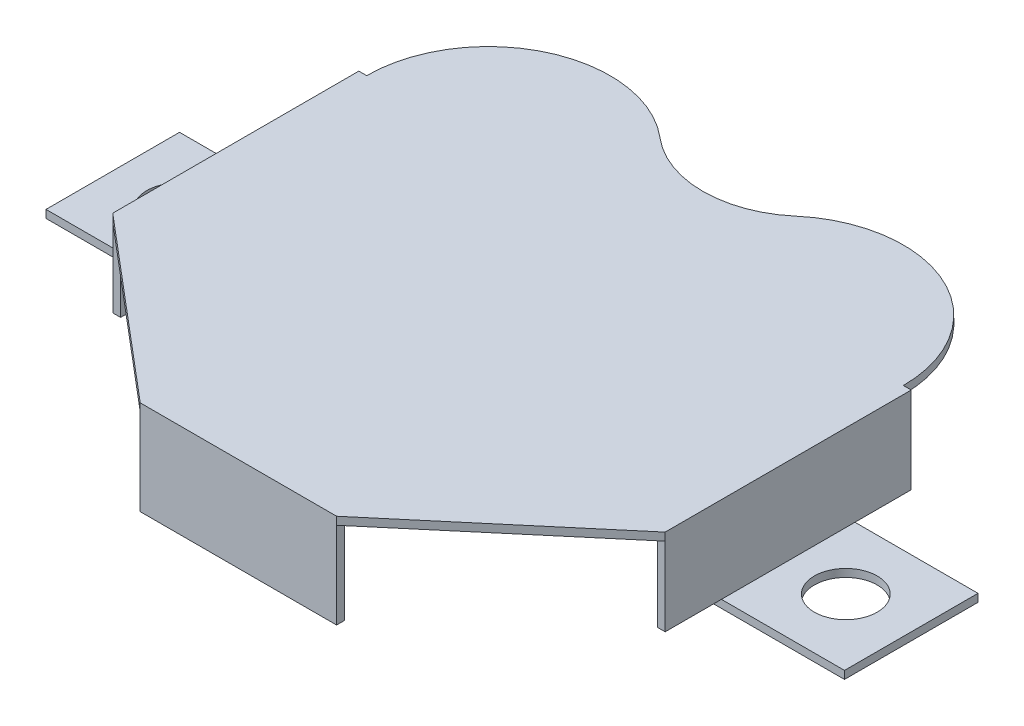
ISO-10303-21;
HEADER;
FILE_DESCRIPTION(('STEP AP214'),'2;1');
FILE_NAME('part.step','',(''),(''),'','','');
FILE_SCHEMA(('AUTOMOTIVE_DESIGN { 1 0 10303 214 1 1 1 1 }'));
ENDSEC;
DATA;
#1=APPLICATION_CONTEXT('core data for automotive mechanical design processes');
#2=APPLICATION_PROTOCOL_DEFINITION('international standard','automotive_design',2000,#1);
#3=PRODUCT_CONTEXT('',#1,'mechanical');
#4=PRODUCT('Part','Part','',(#3));
#5=PRODUCT_RELATED_PRODUCT_CATEGORY('part','',(#4));
#6=PRODUCT_DEFINITION_FORMATION('','',#4);
#7=PRODUCT_DEFINITION_CONTEXT('part definition',#1,'design');
#8=PRODUCT_DEFINITION('design','',#6,#7);
#9=PRODUCT_DEFINITION_SHAPE('','',#8);
#10=(LENGTH_UNIT() NAMED_UNIT(*) SI_UNIT(.MILLI.,.METRE.));
#11=(NAMED_UNIT(*) PLANE_ANGLE_UNIT() SI_UNIT($,.RADIAN.));
#12=(NAMED_UNIT(*) SI_UNIT($,.STERADIAN.) SOLID_ANGLE_UNIT());
#13=UNCERTAINTY_MEASURE_WITH_UNIT(LENGTH_MEASURE(1.E-05),#10,'distance_accuracy_value','');
#14=(GEOMETRIC_REPRESENTATION_CONTEXT(3) GLOBAL_UNCERTAINTY_ASSIGNED_CONTEXT((#13)) GLOBAL_UNIT_ASSIGNED_CONTEXT((#10,
#11,#12)) REPRESENTATION_CONTEXT('',''));
#15=CARTESIAN_POINT('',(0.,0.,0.));
#16=DIRECTION('',(0.,0.,1.));
#17=DIRECTION('',(1.,0.,0.));
#18=AXIS2_PLACEMENT_3D('',#15,#16,#17);
#19=CARTESIAN_POINT('',(-5.6,3.3,-4.7));
#20=DIRECTION('',(0.,-1.,0.));
#21=DIRECTION('',(0.,0.,-1.));
#22=AXIS2_PLACEMENT_3D('',#19,#20,#21);
#23=PLANE('',#22);
#24=CARTESIAN_POINT('',(5.60000000000001,3.3,-4.7));
#25=DIRECTION('',(0.,1.,0.));
#26=DIRECTION('',(0.,0.,1.));
#27=AXIS2_PLACEMENT_3D('',#24,#25,#26);
#28=CIRCLE('',#27,4.64999999999999);
#29=CARTESIAN_POINT('',(10.25,3.3,-4.7));
#30=VERTEX_POINT('',#29);
#31=CARTESIAN_POINT('',(2.58755539714736,3.3,-8.24227010753611));
#32=VERTEX_POINT('',#31);
#33=EDGE_CURVE('E386',#30,#32,#28,.T.);
#34=ORIENTED_EDGE('',*,*,#33,.F.);
#35=DIRECTION('',(0.,0.,1.));
#36=VECTOR('',#35,1.);
#37=CARTESIAN_POINT('',(10.25,3.3,-4.7));
#38=LINE('',#37,#36);
#39=CARTESIAN_POINT('',(10.25,3.3,4.7));
#40=VERTEX_POINT('',#39);
#41=EDGE_CURVE('E52',#30,#40,#38,.T.);
#42=ORIENTED_EDGE('',*,*,#41,.T.);
#43=DIRECTION('',(1.,0.,0.));
#44=VECTOR('',#43,1.);
#45=CARTESIAN_POINT('',(10.25,3.3,4.7));
#46=LINE('',#45,#44);
#47=CARTESIAN_POINT('',(10.55,3.3,4.7));
#48=VERTEX_POINT('',#47);
#49=EDGE_CURVE('E236',#40,#48,#46,.T.);
#50=ORIENTED_EDGE('',*,*,#49,.T.);
#51=DIRECTION('',(0.763599215260191,0.,-0.645690512903838));
#52=VECTOR('',#51,1.);
#53=CARTESIAN_POINT('',(3.75,3.3,10.45));
#54=LINE('',#53,#52);
#55=CARTESIAN_POINT('',(3.75,3.3,10.45));
#56=VERTEX_POINT('',#55);
#57=EDGE_CURVE('E355',#56,#48,#54,.T.);
#58=ORIENTED_EDGE('',*,*,#57,.F.);
#59=DIRECTION('',(0.,0.,-1.));
#60=VECTOR('',#59,1.);
#61=CARTESIAN_POINT('',(3.75,3.3,10.15));
#62=LINE('',#61,#60);
#63=CARTESIAN_POINT('',(3.75,3.3,10.15));
#64=VERTEX_POINT('',#63);
#65=EDGE_CURVE('E420',#56,#64,#62,.T.);
#66=ORIENTED_EDGE('',*,*,#65,.T.);
#67=DIRECTION('',(-1.,0.,0.));
#68=VECTOR('',#67,1.);
#69=CARTESIAN_POINT('',(3.75,3.3,10.15));
#70=LINE('',#69,#68);
#71=CARTESIAN_POINT('',(-3.75,3.3,10.15));
#72=VERTEX_POINT('',#71);
#73=EDGE_CURVE('E417',#64,#72,#70,.T.);
#74=ORIENTED_EDGE('',*,*,#73,.T.);
#75=DIRECTION('',(0.,0.,1.));
#76=VECTOR('',#75,1.);
#77=CARTESIAN_POINT('',(-3.75,3.3,10.15));
#78=LINE('',#77,#76);
#79=CARTESIAN_POINT('',(-3.75,3.3,10.45));
#80=VERTEX_POINT('',#79);
#81=EDGE_CURVE('E394',#72,#80,#78,.T.);
#82=ORIENTED_EDGE('',*,*,#81,.T.);
#83=DIRECTION('',(-0.76359921526019,0.,-0.645690512903838));
#84=VECTOR('',#83,1.);
#85=CARTESIAN_POINT('',(-3.75,3.3,10.45));
#86=LINE('',#85,#84);
#87=CARTESIAN_POINT('',(-10.55,3.3,4.7));
#88=VERTEX_POINT('',#87);
#89=EDGE_CURVE('E377',#80,#88,#86,.T.);
#90=ORIENTED_EDGE('',*,*,#89,.T.);
#91=DIRECTION('',(1.,0.,0.));
#92=VECTOR('',#91,1.);
#93=CARTESIAN_POINT('',(-10.55,3.3,4.7));
#94=LINE('',#93,#92);
#95=CARTESIAN_POINT('',(-10.25,3.3,4.7));
#96=VERTEX_POINT('',#95);
#97=EDGE_CURVE('E285',#88,#96,#94,.T.);
#98=ORIENTED_EDGE('',*,*,#97,.T.);
#99=DIRECTION('',(0.,0.,-1.));
#100=VECTOR('',#99,1.);
#101=CARTESIAN_POINT('',(-10.25,3.3,-4.7));
#102=LINE('',#101,#100);
#103=CARTESIAN_POINT('',(-10.25,3.3,-4.7));
#104=VERTEX_POINT('',#103);
#105=EDGE_CURVE('E288',#96,#104,#102,.T.);
#106=ORIENTED_EDGE('',*,*,#105,.T.);
#107=CARTESIAN_POINT('',(-5.6,3.3,-4.7));
#108=DIRECTION('',(0.,-1.,0.));
#109=DIRECTION('',(0.,0.,-1.));
#110=AXIS2_PLACEMENT_3D('',#107,#108,#109);
#111=CIRCLE('',#110,4.65);
#112=CARTESIAN_POINT('',(-2.58755539714735,3.3,-8.24227010753611));
#113=VERTEX_POINT('',#112);
#114=EDGE_CURVE('E380',#104,#113,#111,.T.);
#115=ORIENTED_EDGE('',*,*,#114,.T.);
#116=CARTESIAN_POINT('',(0.,3.3,-11.284921954554));
#117=DIRECTION('',(0.,1.,0.));
#118=DIRECTION('',(0.,0.,1.));
#119=AXIS2_PLACEMENT_3D('',#116,#117,#118);
#120=CIRCLE('',#119,3.99414236044085);
#121=EDGE_CURVE('E383',#113,#32,#120,.T.);
#122=ORIENTED_EDGE('',*,*,#121,.T.);
#123=EDGE_LOOP('',(#34,#42,#50,#58,#66,#74,#82,#90,#98,#106,#115,#122));
#124=FACE_BOUND('',#123,.T.);
#125=ADVANCED_FACE('F37',(#124),#23,.T.);
#126=CARTESIAN_POINT('',(-3.75,0.3,10.15));
#127=DIRECTION('',(1.,0.,0.));
#128=DIRECTION('',(0.,0.,-1.));
#129=AXIS2_PLACEMENT_3D('',#126,#127,#128);
#130=PLANE('',#129);
#131=DIRECTION('',(0.,0.,1.));
#132=VECTOR('',#131,1.);
#133=CARTESIAN_POINT('',(-3.75,0.,10.15));
#134=LINE('',#133,#132);
#135=CARTESIAN_POINT('',(-3.75,0.,10.15));
#136=VERTEX_POINT('',#135);
#137=CARTESIAN_POINT('',(-3.75,0.,10.45));
#138=VERTEX_POINT('',#137);
#139=EDGE_CURVE('E11',#136,#138,#134,.T.);
#140=ORIENTED_EDGE('',*,*,#139,.T.);
#141=DIRECTION('',(0.,-1.,0.));
#142=VECTOR('',#141,1.);
#143=CARTESIAN_POINT('',(-3.75,0.3,10.45));
#144=LINE('',#143,#142);
#145=EDGE_CURVE('E423',#80,#138,#144,.T.);
#146=ORIENTED_EDGE('',*,*,#145,.F.);
#147=ORIENTED_EDGE('',*,*,#81,.F.);
#148=DIRECTION('',(0.,-1.,0.));
#149=VECTOR('',#148,1.);
#150=CARTESIAN_POINT('',(-3.75,0.3,10.15));
#151=LINE('',#150,#149);
#152=EDGE_CURVE('E431',#72,#136,#151,.T.);
#153=ORIENTED_EDGE('',*,*,#152,.T.);
#154=EDGE_LOOP('',(#140,#146,#147,#153));
#155=FACE_BOUND('',#154,.T.);
#156=ADVANCED_FACE('F449',(#155),#130,.F.);
#157=CARTESIAN_POINT('',(-3.75,0.3,10.45));
#158=DIRECTION('',(0.,0.,-1.));
#159=DIRECTION('',(-1.,0.,0.));
#160=AXIS2_PLACEMENT_3D('',#157,#158,#159);
#161=PLANE('',#160);
#162=DIRECTION('',(1.,0.,0.));
#163=VECTOR('',#162,1.);
#164=CARTESIAN_POINT('',(-3.75,0.,10.45));
#165=LINE('',#164,#163);
#166=CARTESIAN_POINT('',(3.75,0.,10.45));
#167=VERTEX_POINT('',#166);
#168=EDGE_CURVE('E45',#138,#167,#165,.T.);
#169=ORIENTED_EDGE('',*,*,#168,.T.);
#170=DIRECTION('',(0.,-1.,0.));
#171=VECTOR('',#170,1.);
#172=CARTESIAN_POINT('',(3.75,0.3,10.45));
#173=LINE('',#172,#171);
#174=EDGE_CURVE('E425',#56,#167,#173,.T.);
#175=ORIENTED_EDGE('',*,*,#174,.F.);
#176=DIRECTION('',(0.,-1.,0.));
#177=VECTOR('',#176,1.);
#178=CARTESIAN_POINT('',(3.75,3.6,10.45));
#179=LINE('',#178,#177);
#180=CARTESIAN_POINT('',(3.75,3.6,10.45));
#181=VERTEX_POINT('',#180);
#182=EDGE_CURVE('E395',#181,#56,#179,.T.);
#183=ORIENTED_EDGE('',*,*,#182,.F.);
#184=DIRECTION('',(1.,0.,0.));
#185=VECTOR('',#184,1.);
#186=CARTESIAN_POINT('',(-3.75,3.6,10.45));
#187=LINE('',#186,#185);
#188=CARTESIAN_POINT('',(-3.75,3.6,10.45));
#189=VERTEX_POINT('',#188);
#190=EDGE_CURVE('E374',#189,#181,#187,.T.);
#191=ORIENTED_EDGE('',*,*,#190,.F.);
#192=DIRECTION('',(0.,-1.,0.));
#193=VECTOR('',#192,1.);
#194=CARTESIAN_POINT('',(-3.75,3.6,10.45));
#195=LINE('',#194,#193);
#196=EDGE_CURVE('E391',#189,#80,#195,.T.);
#197=ORIENTED_EDGE('',*,*,#196,.T.);
#198=ORIENTED_EDGE('',*,*,#145,.T.);
#199=EDGE_LOOP('',(#169,#175,#183,#191,#197,#198));
#200=FACE_BOUND('',#199,.T.);
#201=ADVANCED_FACE('F438',(#200),#161,.F.);
#202=CARTESIAN_POINT('',(3.75,0.3,10.15));
#203=DIRECTION('',(-1.,0.,0.));
#204=DIRECTION('',(0.,0.,1.));
#205=AXIS2_PLACEMENT_3D('',#202,#203,#204);
#206=PLANE('',#205);
#207=DIRECTION('',(0.,0.,-1.));
#208=VECTOR('',#207,1.);
#209=CARTESIAN_POINT('',(3.75,0.,10.15));
#210=LINE('',#209,#208);
#211=CARTESIAN_POINT('',(3.75,0.,10.15));
#212=VERTEX_POINT('',#211);
#213=EDGE_CURVE('E436',#167,#212,#210,.T.);
#214=ORIENTED_EDGE('',*,*,#213,.T.);
#215=DIRECTION('',(0.,-1.,0.));
#216=VECTOR('',#215,1.);
#217=CARTESIAN_POINT('',(3.75,0.3,10.15));
#218=LINE('',#217,#216);
#219=EDGE_CURVE('E428',#64,#212,#218,.T.);
#220=ORIENTED_EDGE('',*,*,#219,.F.);
#221=ORIENTED_EDGE('',*,*,#65,.F.);
#222=ORIENTED_EDGE('',*,*,#174,.T.);
#223=EDGE_LOOP('',(#214,#220,#221,#222));
#224=FACE_BOUND('',#223,.T.);
#225=ADVANCED_FACE('F442',(#224),#206,.F.);
#226=CARTESIAN_POINT('',(-3.75,0.3,10.15));
#227=DIRECTION('',(0.,0.,1.));
#228=DIRECTION('',(1.,0.,0.));
#229=AXIS2_PLACEMENT_3D('',#226,#227,#228);
#230=PLANE('',#229);
#231=DIRECTION('',(-1.,0.,0.));
#232=VECTOR('',#231,1.);
#233=CARTESIAN_POINT('',(-3.75,0.,10.15));
#234=LINE('',#233,#232);
#235=EDGE_CURVE('E434',#212,#136,#234,.T.);
#236=ORIENTED_EDGE('',*,*,#235,.T.);
#237=ORIENTED_EDGE('',*,*,#152,.F.);
#238=ORIENTED_EDGE('',*,*,#73,.F.);
#239=ORIENTED_EDGE('',*,*,#219,.T.);
#240=EDGE_LOOP('',(#236,#237,#238,#239));
#241=FACE_BOUND('',#240,.T.);
#242=ADVANCED_FACE('F445',(#241),#230,.F.);
#243=CARTESIAN_POINT('',(0.,0.,0.));
#244=DIRECTION('',(0.,1.,0.));
#245=DIRECTION('',(0.,0.,1.));
#246=AXIS2_PLACEMENT_3D('',#243,#244,#245);
#247=PLANE('',#246);
#248=ORIENTED_EDGE('',*,*,#139,.F.);
#249=ORIENTED_EDGE('',*,*,#235,.F.);
#250=ORIENTED_EDGE('',*,*,#213,.F.);
#251=ORIENTED_EDGE('',*,*,#168,.F.);
#252=EDGE_LOOP('',(#248,#249,#250,#251));
#253=FACE_BOUND('',#252,.T.);
#254=ADVANCED_FACE('F39',(#253),#247,.F.);
#255=CARTESIAN_POINT('',(-3.75,3.6,10.45));
#256=DIRECTION('',(-0.645690512903838,0.,0.76359921526019));
#257=DIRECTION('',(0.763599215260191,0.,0.645690512903838));
#258=AXIS2_PLACEMENT_3D('',#255,#256,#257);
#259=PLANE('',#258);
#260=ORIENTED_EDGE('',*,*,#89,.F.);
#261=ORIENTED_EDGE('',*,*,#196,.F.);
#262=DIRECTION('',(-0.76359921526019,0.,-0.645690512903838));
#263=VECTOR('',#262,1.);
#264=CARTESIAN_POINT('',(-3.75,3.6,10.45));
#265=LINE('',#264,#263);
#266=CARTESIAN_POINT('',(-10.55,3.6,4.7));
#267=VERTEX_POINT('',#266);
#268=EDGE_CURVE('E351',#189,#267,#265,.T.);
#269=ORIENTED_EDGE('',*,*,#268,.T.);
#270=DIRECTION('',(0.,-1.,0.));
#271=VECTOR('',#270,1.);
#272=CARTESIAN_POINT('',(-10.55,3.6,4.7));
#273=LINE('',#272,#271);
#274=EDGE_CURVE('E376',#267,#88,#273,.T.);
#275=ORIENTED_EDGE('',*,*,#274,.T.);
#276=EDGE_LOOP('',(#260,#261,#269,#275));
#277=FACE_BOUND('',#276,.T.);
#278=ADVANCED_FACE('F540',(#277),#259,.T.);
#279=CARTESIAN_POINT('',(3.75,3.6,10.45));
#280=DIRECTION('',(-0.645690512903838,0.,-0.763599215260191));
#281=DIRECTION('',(-0.763599215260191,0.,0.645690512903838));
#282=AXIS2_PLACEMENT_3D('',#279,#280,#281);
#283=PLANE('',#282);
#284=ORIENTED_EDGE('',*,*,#57,.T.);
#285=DIRECTION('',(0.,-1.,0.));
#286=VECTOR('',#285,1.);
#287=CARTESIAN_POINT('',(10.55,3.6,4.7));
#288=LINE('',#287,#286);
#289=CARTESIAN_POINT('',(10.55,3.6,4.7));
#290=VERTEX_POINT('',#289);
#291=EDGE_CURVE('E398',#290,#48,#288,.T.);
#292=ORIENTED_EDGE('',*,*,#291,.F.);
#293=DIRECTION('',(0.763599215260191,0.,-0.645690512903838));
#294=VECTOR('',#293,1.);
#295=CARTESIAN_POINT('',(3.75,3.6,10.45));
#296=LINE('',#295,#294);
#297=EDGE_CURVE('E372',#181,#290,#296,.T.);
#298=ORIENTED_EDGE('',*,*,#297,.F.);
#299=ORIENTED_EDGE('',*,*,#182,.T.);
#300=EDGE_LOOP('',(#284,#292,#298,#299));
#301=FACE_BOUND('',#300,.T.);
#302=ADVANCED_FACE('F454',(#301),#283,.F.);
#303=CARTESIAN_POINT('',(10.55,3.6,-4.7));
#304=DIRECTION('',(1.,0.,0.));
#305=DIRECTION('',(0.,0.,-1.));
#306=AXIS2_PLACEMENT_3D('',#303,#304,#305);
#307=PLANE('',#306);
#308=ORIENTED_EDGE('',*,*,#291,.T.);
#309=DIRECTION('',(0.,-1.,0.));
#310=VECTOR('',#309,1.);
#311=CARTESIAN_POINT('',(10.55,3.3,4.7));
#312=LINE('',#311,#310);
#313=CARTESIAN_POINT('',(10.55,0.3,4.7));
#314=VERTEX_POINT('',#313);
#315=EDGE_CURVE('E237',#48,#314,#312,.T.);
#316=ORIENTED_EDGE('',*,*,#315,.T.);
#317=DIRECTION('',(0.,0.,-1.));
#318=VECTOR('',#317,1.);
#319=CARTESIAN_POINT('',(10.55,0.3,-4.7));
#320=LINE('',#319,#318);
#321=CARTESIAN_POINT('',(10.55,0.3,2.55));
#322=VERTEX_POINT('',#321);
#323=EDGE_CURVE('E467',#314,#322,#320,.T.);
#324=ORIENTED_EDGE('',*,*,#323,.T.);
#325=CARTESIAN_POINT('',(10.55,0.3,-2.55));
#326=VERTEX_POINT('',#325);
#327=EDGE_CURVE('E284',#322,#326,#320,.T.);
#328=ORIENTED_EDGE('',*,*,#327,.T.);
#329=CARTESIAN_POINT('',(10.55,0.3,-4.7));
#330=VERTEX_POINT('',#329);
#331=EDGE_CURVE('E227',#326,#330,#320,.T.);
#332=ORIENTED_EDGE('',*,*,#331,.T.);
#333=DIRECTION('',(0.,-1.,0.));
#334=VECTOR('',#333,1.);
#335=CARTESIAN_POINT('',(10.55,3.6,-4.7));
#336=LINE('',#335,#334);
#337=CARTESIAN_POINT('',(10.55,3.6,-4.7));
#338=VERTEX_POINT('',#337);
#339=EDGE_CURVE('E222',#338,#330,#336,.T.);
#340=ORIENTED_EDGE('',*,*,#339,.F.);
#341=DIRECTION('',(0.,0.,1.));
#342=VECTOR('',#341,1.);
#343=CARTESIAN_POINT('',(10.55,3.6,-4.7));
#344=LINE('',#343,#342);
#345=EDGE_CURVE('E369',#338,#290,#344,.T.);
#346=ORIENTED_EDGE('',*,*,#345,.T.);
#347=EDGE_LOOP('',(#308,#316,#324,#328,#332,#340,#346));
#348=FACE_BOUND('',#347,.T.);
#349=ADVANCED_FACE('F539',(#348),#307,.T.);
#350=CARTESIAN_POINT('',(10.25,3.6,-4.7));
#351=DIRECTION('',(0.,0.,-1.));
#352=DIRECTION('',(-1.,0.,0.));
#353=AXIS2_PLACEMENT_3D('',#350,#351,#352);
#354=PLANE('',#353);
#355=ORIENTED_EDGE('',*,*,#339,.T.);
#356=DIRECTION('',(-1.,0.,0.));
#357=VECTOR('',#356,1.);
#358=CARTESIAN_POINT('',(10.25,0.3,-4.7));
#359=LINE('',#358,#357);
#360=CARTESIAN_POINT('',(10.25,0.3,-4.7));
#361=VERTEX_POINT('',#360);
#362=EDGE_CURVE('E217',#330,#361,#359,.T.);
#363=ORIENTED_EDGE('',*,*,#362,.T.);
#364=DIRECTION('',(0.,-1.,0.));
#365=VECTOR('',#364,1.);
#366=CARTESIAN_POINT('',(10.25,3.3,-4.7));
#367=LINE('',#366,#365);
#368=EDGE_CURVE('E220',#30,#361,#367,.T.);
#369=ORIENTED_EDGE('',*,*,#368,.F.);
#370=DIRECTION('',(0.,-1.,0.));
#371=VECTOR('',#370,1.);
#372=CARTESIAN_POINT('',(10.25,3.6,-4.7));
#373=LINE('',#372,#371);
#374=CARTESIAN_POINT('',(10.25,3.6,-4.7));
#375=VERTEX_POINT('',#374);
#376=EDGE_CURVE('E402',#375,#30,#373,.T.);
#377=ORIENTED_EDGE('',*,*,#376,.F.);
#378=DIRECTION('',(1.,0.,0.));
#379=VECTOR('',#378,1.);
#380=CARTESIAN_POINT('',(10.25,3.6,-4.7));
#381=LINE('',#380,#379);
#382=EDGE_CURVE('E367',#375,#338,#381,.T.);
#383=ORIENTED_EDGE('',*,*,#382,.T.);
#384=EDGE_LOOP('',(#355,#363,#369,#377,#383));
#385=FACE_BOUND('',#384,.T.);
#386=ADVANCED_FACE('F219',(#385),#354,.T.);
#387=CARTESIAN_POINT('',(5.60000000000001,3.6,-4.7));
#388=DIRECTION('',(0.,-1.,0.));
#389=DIRECTION('',(0.,0.,-1.));
#390=AXIS2_PLACEMENT_3D('',#387,#388,#389);
#391=CYLINDRICAL_SURFACE('',#390,4.64999999999999);
#392=ORIENTED_EDGE('',*,*,#33,.T.);
#393=DIRECTION('',(0.,-1.,0.));
#394=VECTOR('',#393,1.);
#395=CARTESIAN_POINT('',(2.58755539714736,3.6,-8.24227010753611));
#396=LINE('',#395,#394);
#397=CARTESIAN_POINT('',(2.58755539714736,3.6,-8.24227010753611));
#398=VERTEX_POINT('',#397);
#399=EDGE_CURVE('E404',#398,#32,#396,.T.);
#400=ORIENTED_EDGE('',*,*,#399,.F.);
#401=CARTESIAN_POINT('',(5.60000000000001,3.6,-4.7));
#402=DIRECTION('',(0.,1.,0.));
#403=DIRECTION('',(0.,0.,1.));
#404=AXIS2_PLACEMENT_3D('',#401,#402,#403);
#405=CIRCLE('',#404,4.64999999999999);
#406=EDGE_CURVE('E365',#375,#398,#405,.T.);
#407=ORIENTED_EDGE('',*,*,#406,.F.);
#408=ORIENTED_EDGE('',*,*,#376,.T.);
#409=EDGE_LOOP('',(#392,#400,#407,#408));
#410=FACE_BOUND('',#409,.T.);
#411=ADVANCED_FACE('F545',(#410),#391,.T.);
#412=CARTESIAN_POINT('',(0.,3.6,-11.284921954554));
#413=DIRECTION('',(0.,-1.,0.));
#414=DIRECTION('',(0.,0.,-1.));
#415=AXIS2_PLACEMENT_3D('',#412,#413,#414);
#416=CYLINDRICAL_SURFACE('',#415,3.99414236044085);
#417=ORIENTED_EDGE('',*,*,#121,.F.);
#418=DIRECTION('',(0.,-1.,0.));
#419=VECTOR('',#418,1.);
#420=CARTESIAN_POINT('',(-2.58755539714735,3.6,-8.24227010753611));
#421=LINE('',#420,#419);
#422=CARTESIAN_POINT('',(-2.58755539714735,3.6,-8.24227010753611));
#423=VERTEX_POINT('',#422);
#424=EDGE_CURVE('E406',#423,#113,#421,.T.);
#425=ORIENTED_EDGE('',*,*,#424,.F.);
#426=CARTESIAN_POINT('',(0.,3.6,-11.284921954554));
#427=DIRECTION('',(0.,1.,0.));
#428=DIRECTION('',(0.,0.,1.));
#429=AXIS2_PLACEMENT_3D('',#426,#427,#428);
#430=CIRCLE('',#429,3.99414236044085);
#431=EDGE_CURVE('E362',#423,#398,#430,.T.);
#432=ORIENTED_EDGE('',*,*,#431,.T.);
#433=ORIENTED_EDGE('',*,*,#399,.T.);
#434=EDGE_LOOP('',(#417,#425,#432,#433));
#435=FACE_BOUND('',#434,.T.);
#436=ADVANCED_FACE('F548',(#435),#416,.F.);
#437=CARTESIAN_POINT('',(-5.6,3.6,-4.7));
#438=DIRECTION('',(0.,-1.,0.));
#439=DIRECTION('',(0.,0.,-1.));
#440=AXIS2_PLACEMENT_3D('',#437,#438,#439);
#441=CYLINDRICAL_SURFACE('',#440,4.65);
#442=ORIENTED_EDGE('',*,*,#114,.F.);
#443=DIRECTION('',(0.,-1.,0.));
#444=VECTOR('',#443,1.);
#445=CARTESIAN_POINT('',(-10.25,3.6,-4.7));
#446=LINE('',#445,#444);
#447=CARTESIAN_POINT('',(-10.25,3.6,-4.7));
#448=VERTEX_POINT('',#447);
#449=EDGE_CURVE('E408',#448,#104,#446,.T.);
#450=ORIENTED_EDGE('',*,*,#449,.F.);
#451=CARTESIAN_POINT('',(-5.6,3.6,-4.7));
#452=DIRECTION('',(0.,-1.,0.));
#453=DIRECTION('',(0.,0.,-1.));
#454=AXIS2_PLACEMENT_3D('',#451,#452,#453);
#455=CIRCLE('',#454,4.65);
#456=EDGE_CURVE('E359',#448,#423,#455,.T.);
#457=ORIENTED_EDGE('',*,*,#456,.T.);
#458=ORIENTED_EDGE('',*,*,#424,.T.);
#459=EDGE_LOOP('',(#442,#450,#457,#458));
#460=FACE_BOUND('',#459,.T.);
#461=ADVANCED_FACE('F500',(#460),#441,.T.);
#462=CARTESIAN_POINT('',(-10.25,3.6,-4.7));
#463=DIRECTION('',(0.,0.,1.));
#464=DIRECTION('',(1.,0.,0.));
#465=AXIS2_PLACEMENT_3D('',#462,#463,#464);
#466=PLANE('',#465);
#467=ORIENTED_EDGE('',*,*,#449,.T.);
#468=DIRECTION('',(0.,-1.,0.));
#469=VECTOR('',#468,1.);
#470=CARTESIAN_POINT('',(-10.25,3.3,-4.7));
#471=LINE('',#470,#469);
#472=CARTESIAN_POINT('',(-10.25,0.3,-4.7));
#473=VERTEX_POINT('',#472);
#474=EDGE_CURVE('E292',#104,#473,#471,.T.);
#475=ORIENTED_EDGE('',*,*,#474,.T.);
#476=DIRECTION('',(-1.,0.,0.));
#477=VECTOR('',#476,1.);
#478=CARTESIAN_POINT('',(-10.55,0.3,-4.7));
#479=LINE('',#478,#477);
#480=CARTESIAN_POINT('',(-10.55,0.3,-4.7));
#481=VERTEX_POINT('',#480);
#482=EDGE_CURVE('E289',#473,#481,#479,.T.);
#483=ORIENTED_EDGE('',*,*,#482,.T.);
#484=DIRECTION('',(0.,-1.,0.));
#485=VECTOR('',#484,1.);
#486=CARTESIAN_POINT('',(-10.55,3.6,-4.7));
#487=LINE('',#486,#485);
#488=CARTESIAN_POINT('',(-10.55,3.6,-4.7));
#489=VERTEX_POINT('',#488);
#490=EDGE_CURVE('E411',#489,#481,#487,.T.);
#491=ORIENTED_EDGE('',*,*,#490,.F.);
#492=DIRECTION('',(-1.,0.,0.));
#493=VECTOR('',#492,1.);
#494=CARTESIAN_POINT('',(-10.25,3.6,-4.7));
#495=LINE('',#494,#493);
#496=EDGE_CURVE('E357',#448,#489,#495,.T.);
#497=ORIENTED_EDGE('',*,*,#496,.F.);
#498=EDGE_LOOP('',(#467,#475,#483,#491,#497));
#499=FACE_BOUND('',#498,.T.);
#500=ADVANCED_FACE('F494',(#499),#466,.F.);
#501=CARTESIAN_POINT('',(-10.55,3.6,-4.7));
#502=DIRECTION('',(1.,0.,0.));
#503=DIRECTION('',(0.,0.,-1.));
#504=AXIS2_PLACEMENT_3D('',#501,#502,#503);
#505=PLANE('',#504);
#506=ORIENTED_EDGE('',*,*,#490,.T.);
#507=DIRECTION('',(0.,0.,1.));
#508=VECTOR('',#507,1.);
#509=CARTESIAN_POINT('',(-10.55,0.3,-4.7));
#510=LINE('',#509,#508);
#511=CARTESIAN_POINT('',(-10.55,0.3,-2.55));
#512=VERTEX_POINT('',#511);
#513=EDGE_CURVE('E293',#481,#512,#510,.T.);
#514=ORIENTED_EDGE('',*,*,#513,.T.);
#515=CARTESIAN_POINT('',(-10.55,0.3,2.55));
#516=VERTEX_POINT('',#515);
#517=EDGE_CURVE('E298',#512,#516,#510,.T.);
#518=ORIENTED_EDGE('',*,*,#517,.T.);
#519=CARTESIAN_POINT('',(-10.55,0.3,4.7));
#520=VERTEX_POINT('',#519);
#521=EDGE_CURVE('E297',#516,#520,#510,.T.);
#522=ORIENTED_EDGE('',*,*,#521,.T.);
#523=DIRECTION('',(0.,-1.,0.));
#524=VECTOR('',#523,1.);
#525=CARTESIAN_POINT('',(-10.55,3.3,4.7));
#526=LINE('',#525,#524);
#527=EDGE_CURVE('E311',#88,#520,#526,.T.);
#528=ORIENTED_EDGE('',*,*,#527,.F.);
#529=ORIENTED_EDGE('',*,*,#274,.F.);
#530=DIRECTION('',(0.,0.,1.));
#531=VECTOR('',#530,1.);
#532=CARTESIAN_POINT('',(-10.55,3.6,-4.7));
#533=LINE('',#532,#531);
#534=EDGE_CURVE('E354',#489,#267,#533,.T.);
#535=ORIENTED_EDGE('',*,*,#534,.F.);
#536=EDGE_LOOP('',(#506,#514,#518,#522,#528,#529,#535));
#537=FACE_BOUND('',#536,.T.);
#538=ADVANCED_FACE('F474',(#537),#505,.F.);
#539=CARTESIAN_POINT('',(-5.6,3.6,-4.7));
#540=DIRECTION('',(0.,-1.,0.));
#541=DIRECTION('',(0.,0.,-1.));
#542=AXIS2_PLACEMENT_3D('',#539,#540,#541);
#543=PLANE('',#542);
#544=ORIENTED_EDGE('',*,*,#268,.F.);
#545=ORIENTED_EDGE('',*,*,#190,.T.);
#546=ORIENTED_EDGE('',*,*,#297,.T.);
#547=ORIENTED_EDGE('',*,*,#345,.F.);
#548=ORIENTED_EDGE('',*,*,#382,.F.);
#549=ORIENTED_EDGE('',*,*,#406,.T.);
#550=ORIENTED_EDGE('',*,*,#431,.F.);
#551=ORIENTED_EDGE('',*,*,#456,.F.);
#552=ORIENTED_EDGE('',*,*,#496,.T.);
#553=ORIENTED_EDGE('',*,*,#534,.T.);
#554=EDGE_LOOP('',(#544,#545,#546,#547,#548,#549,#550,#551,#552,#553));
#555=FACE_BOUND('',#554,.T.);
#556=ADVANCED_FACE('F535',(#555),#543,.F.);
#557=CARTESIAN_POINT('',(0.,0.3,0.));
#558=DIRECTION('',(0.,1.,0.));
#559=DIRECTION('',(0.,0.,1.));
#560=AXIS2_PLACEMENT_3D('',#557,#558,#559);
#561=PLANE('',#560);
#562=ORIENTED_EDGE('',*,*,#517,.F.);
#563=DIRECTION('',(-1.,0.,0.));
#564=VECTOR('',#563,1.);
#565=CARTESIAN_POINT('',(-15.25,0.3,-2.55));
#566=LINE('',#565,#564);
#567=CARTESIAN_POINT('',(-15.25,0.3,-2.55));
#568=VERTEX_POINT('',#567);
#569=EDGE_CURVE('E326',#512,#568,#566,.T.);
#570=ORIENTED_EDGE('',*,*,#569,.T.);
#571=DIRECTION('',(0.,0.,1.));
#572=VECTOR('',#571,1.);
#573=CARTESIAN_POINT('',(-15.25,0.3,-2.55));
#574=LINE('',#573,#572);
#575=CARTESIAN_POINT('',(-15.25,0.3,2.55));
#576=VERTEX_POINT('',#575);
#577=EDGE_CURVE('E330',#568,#576,#574,.T.);
#578=ORIENTED_EDGE('',*,*,#577,.T.);
#579=DIRECTION('',(1.,0.,0.));
#580=VECTOR('',#579,1.);
#581=CARTESIAN_POINT('',(-15.25,0.3,2.55));
#582=LINE('',#581,#580);
#583=EDGE_CURVE('E342',#576,#516,#582,.T.);
#584=ORIENTED_EDGE('',*,*,#583,.T.);
#585=EDGE_LOOP('',(#562,#570,#578,#584));
#586=FACE_BOUND('',#585,.T.);
#587=CARTESIAN_POINT('',(-12.75,0.3,0.));
#588=DIRECTION('',(0.,1.,0.));
#589=DIRECTION('',(0.,0.,1.));
#590=AXIS2_PLACEMENT_3D('',#587,#588,#589);
#591=CIRCLE('',#590,1.2);
#592=CARTESIAN_POINT('',(-12.75,0.3,1.2));
#593=VERTEX_POINT('',#592);
#594=EDGE_CURVE('E337',#593,#593,#591,.T.);
#595=ORIENTED_EDGE('',*,*,#594,.F.);
#596=EDGE_LOOP('',(#595));
#597=FACE_BOUND('',#596,.T.);
#598=ADVANCED_FACE('F478',(#586,#597),#561,.T.);
#599=CARTESIAN_POINT('',(0.,0.,0.));
#600=DIRECTION('',(0.,1.,0.));
#601=DIRECTION('',(0.,0.,1.));
#602=AXIS2_PLACEMENT_3D('',#599,#600,#601);
#603=PLANE('',#602);
#604=DIRECTION('',(0.,0.,1.));
#605=VECTOR('',#604,1.);
#606=CARTESIAN_POINT('',(-15.25,0.,-2.55));
#607=LINE('',#606,#605);
#608=CARTESIAN_POINT('',(-15.25,0.,-2.55));
#609=VERTEX_POINT('',#608);
#610=CARTESIAN_POINT('',(-15.25,0.,2.55));
#611=VERTEX_POINT('',#610);
#612=EDGE_CURVE('E334',#609,#611,#607,.T.);
#613=ORIENTED_EDGE('',*,*,#612,.F.);
#614=DIRECTION('',(-1.,0.,0.));
#615=VECTOR('',#614,1.);
#616=CARTESIAN_POINT('',(-15.25,0.,-2.55));
#617=LINE('',#616,#615);
#618=CARTESIAN_POINT('',(-10.25,0.,-2.55));
#619=VERTEX_POINT('',#618);
#620=EDGE_CURVE('E327',#619,#609,#617,.T.);
#621=ORIENTED_EDGE('',*,*,#620,.F.);
#622=DIRECTION('',(0.,0.,-1.));
#623=VECTOR('',#622,1.);
#624=CARTESIAN_POINT('',(-10.25,0.,-2.55));
#625=LINE('',#624,#623);
#626=CARTESIAN_POINT('',(-10.25,0.,2.55));
#627=VERTEX_POINT('',#626);
#628=EDGE_CURVE('E329',#627,#619,#625,.T.);
#629=ORIENTED_EDGE('',*,*,#628,.F.);
#630=DIRECTION('',(1.,0.,0.));
#631=VECTOR('',#630,1.);
#632=CARTESIAN_POINT('',(-15.25,0.,2.55));
#633=LINE('',#632,#631);
#634=EDGE_CURVE('E332',#611,#627,#633,.T.);
#635=ORIENTED_EDGE('',*,*,#634,.F.);
#636=EDGE_LOOP('',(#613,#621,#629,#635));
#637=FACE_BOUND('',#636,.T.);
#638=CARTESIAN_POINT('',(-12.75,0.,0.));
#639=DIRECTION('',(0.,1.,0.));
#640=DIRECTION('',(0.,0.,1.));
#641=AXIS2_PLACEMENT_3D('',#638,#639,#640);
#642=CIRCLE('',#641,1.2);
#643=CARTESIAN_POINT('',(-12.75,0.,1.2));
#644=VERTEX_POINT('',#643);
#645=EDGE_CURVE('E346',#644,#644,#642,.T.);
#646=ORIENTED_EDGE('',*,*,#645,.T.);
#647=EDGE_LOOP('',(#646));
#648=FACE_BOUND('',#647,.T.);
#649=ADVANCED_FACE('F513',(#637,#648),#603,.F.);
#650=CARTESIAN_POINT('',(-15.25,0.3,-2.55));
#651=DIRECTION('',(1.,0.,0.));
#652=DIRECTION('',(0.,0.,-1.));
#653=AXIS2_PLACEMENT_3D('',#650,#651,#652);
#654=PLANE('',#653);
#655=ORIENTED_EDGE('',*,*,#612,.T.);
#656=DIRECTION('',(0.,-1.,0.));
#657=VECTOR('',#656,1.);
#658=CARTESIAN_POINT('',(-15.25,0.3,2.55));
#659=LINE('',#658,#657);
#660=EDGE_CURVE('E314',#576,#611,#659,.T.);
#661=ORIENTED_EDGE('',*,*,#660,.F.);
#662=ORIENTED_EDGE('',*,*,#577,.F.);
#663=DIRECTION('',(0.,-1.,0.));
#664=VECTOR('',#663,1.);
#665=CARTESIAN_POINT('',(-15.25,0.3,-2.55));
#666=LINE('',#665,#664);
#667=EDGE_CURVE('E323',#568,#609,#666,.T.);
#668=ORIENTED_EDGE('',*,*,#667,.T.);
#669=EDGE_LOOP('',(#655,#661,#662,#668));
#670=FACE_BOUND('',#669,.T.);
#671=ADVANCED_FACE('F516',(#670),#654,.F.);
#672=CARTESIAN_POINT('',(-15.25,0.3,2.55));
#673=DIRECTION('',(0.,0.,-1.));
#674=DIRECTION('',(-1.,0.,0.));
#675=AXIS2_PLACEMENT_3D('',#672,#673,#674);
#676=PLANE('',#675);
#677=ORIENTED_EDGE('',*,*,#634,.T.);
#678=DIRECTION('',(0.,-1.,0.));
#679=VECTOR('',#678,1.);
#680=CARTESIAN_POINT('',(-10.25,0.3,2.55));
#681=LINE('',#680,#679);
#682=CARTESIAN_POINT('',(-10.25,0.3,2.55));
#683=VERTEX_POINT('',#682);
#684=EDGE_CURVE('E317',#683,#627,#681,.T.);
#685=ORIENTED_EDGE('',*,*,#684,.F.);
#686=EDGE_CURVE('E341',#516,#683,#582,.T.);
#687=ORIENTED_EDGE('',*,*,#686,.F.);
#688=ORIENTED_EDGE('',*,*,#583,.F.);
#689=ORIENTED_EDGE('',*,*,#660,.T.);
#690=EDGE_LOOP('',(#677,#685,#687,#688,#689));
#691=FACE_BOUND('',#690,.T.);
#692=ADVANCED_FACE('F508',(#691),#676,.F.);
#693=CARTESIAN_POINT('',(-10.25,0.3,-2.55));
#694=DIRECTION('',(-1.,0.,0.));
#695=DIRECTION('',(0.,0.,1.));
#696=AXIS2_PLACEMENT_3D('',#693,#694,#695);
#697=PLANE('',#696);
#698=ORIENTED_EDGE('',*,*,#628,.T.);
#699=DIRECTION('',(0.,-1.,0.));
#700=VECTOR('',#699,1.);
#701=CARTESIAN_POINT('',(-10.25,0.3,-2.55));
#702=LINE('',#701,#700);
#703=CARTESIAN_POINT('',(-10.25,0.3,-2.55));
#704=VERTEX_POINT('',#703);
#705=EDGE_CURVE('E320',#704,#619,#702,.T.);
#706=ORIENTED_EDGE('',*,*,#705,.F.);
#707=DIRECTION('',(0.,0.,-1.));
#708=VECTOR('',#707,1.);
#709=CARTESIAN_POINT('',(-10.25,0.3,-4.7));
#710=LINE('',#709,#708);
#711=EDGE_CURVE('E300',#704,#473,#710,.T.);
#712=ORIENTED_EDGE('',*,*,#711,.T.);
#713=ORIENTED_EDGE('',*,*,#474,.F.);
#714=ORIENTED_EDGE('',*,*,#105,.F.);
#715=DIRECTION('',(0.,-1.,0.));
#716=VECTOR('',#715,1.);
#717=CARTESIAN_POINT('',(-10.25,3.3,4.7));
#718=LINE('',#717,#716);
#719=CARTESIAN_POINT('',(-10.25,0.3,4.7));
#720=VERTEX_POINT('',#719);
#721=EDGE_CURVE('E308',#96,#720,#718,.T.);
#722=ORIENTED_EDGE('',*,*,#721,.T.);
#723=EDGE_CURVE('E301',#720,#683,#710,.T.);
#724=ORIENTED_EDGE('',*,*,#723,.T.);
#725=ORIENTED_EDGE('',*,*,#684,.T.);
#726=EDGE_LOOP('',(#698,#706,#712,#713,#714,#722,#724,#725));
#727=FACE_BOUND('',#726,.T.);
#728=ADVANCED_FACE('F491',(#727),#697,.F.);
#729=CARTESIAN_POINT('',(-15.25,0.3,-2.55));
#730=DIRECTION('',(0.,0.,1.));
#731=DIRECTION('',(1.,0.,0.));
#732=AXIS2_PLACEMENT_3D('',#729,#730,#731);
#733=PLANE('',#732);
#734=ORIENTED_EDGE('',*,*,#620,.T.);
#735=ORIENTED_EDGE('',*,*,#667,.F.);
#736=ORIENTED_EDGE('',*,*,#569,.F.);
#737=EDGE_CURVE('E338',#704,#512,#566,.T.);
#738=ORIENTED_EDGE('',*,*,#737,.F.);
#739=ORIENTED_EDGE('',*,*,#705,.T.);
#740=EDGE_LOOP('',(#734,#735,#736,#738,#739));
#741=FACE_BOUND('',#740,.T.);
#742=ADVANCED_FACE('F484',(#741),#733,.F.);
#743=CARTESIAN_POINT('',(-12.75,0.3,0.));
#744=DIRECTION('',(0.,-1.,0.));
#745=DIRECTION('',(0.,0.,-1.));
#746=AXIS2_PLACEMENT_3D('',#743,#744,#745);
#747=CYLINDRICAL_SURFACE('',#746,1.2);
#748=ORIENTED_EDGE('',*,*,#594,.T.);
#749=EDGE_LOOP('',(#748));
#750=FACE_BOUND('',#749,.T.);
#751=ORIENTED_EDGE('',*,*,#645,.F.);
#752=EDGE_LOOP('',(#751));
#753=FACE_BOUND('',#752,.T.);
#754=ADVANCED_FACE('F650',(#750,#753),#747,.F.);
#755=CARTESIAN_POINT('',(0.,0.3,0.));
#756=DIRECTION('',(0.,1.,0.));
#757=DIRECTION('',(0.,0.,1.));
#758=AXIS2_PLACEMENT_3D('',#755,#756,#757);
#759=PLANE('',#758);
#760=ORIENTED_EDGE('',*,*,#521,.F.);
#761=ORIENTED_EDGE('',*,*,#686,.T.);
#762=ORIENTED_EDGE('',*,*,#723,.F.);
#763=DIRECTION('',(1.,0.,0.));
#764=VECTOR('',#763,1.);
#765=CARTESIAN_POINT('',(-10.55,0.3,4.7));
#766=LINE('',#765,#764);
#767=EDGE_CURVE('E296',#520,#720,#766,.T.);
#768=ORIENTED_EDGE('',*,*,#767,.F.);
#769=EDGE_LOOP('',(#760,#761,#762,#768));
#770=FACE_BOUND('',#769,.T.);
#771=ADVANCED_FACE('F506',(#770),#759,.F.);
#772=ORIENTED_EDGE('',*,*,#711,.F.);
#773=ORIENTED_EDGE('',*,*,#737,.T.);
#774=ORIENTED_EDGE('',*,*,#513,.F.);
#775=ORIENTED_EDGE('',*,*,#482,.F.);
#776=EDGE_LOOP('',(#772,#773,#774,#775));
#777=FACE_BOUND('',#776,.T.);
#778=ADVANCED_FACE('F488',(#777),#759,.F.);
#779=CARTESIAN_POINT('',(-10.55,3.3,4.7));
#780=DIRECTION('',(0.,0.,-1.));
#781=DIRECTION('',(-1.,0.,0.));
#782=AXIS2_PLACEMENT_3D('',#779,#780,#781);
#783=PLANE('',#782);
#784=ORIENTED_EDGE('',*,*,#767,.T.);
#785=ORIENTED_EDGE('',*,*,#721,.F.);
#786=ORIENTED_EDGE('',*,*,#97,.F.);
#787=ORIENTED_EDGE('',*,*,#527,.T.);
#788=EDGE_LOOP('',(#784,#785,#786,#787));
#789=FACE_BOUND('',#788,.T.);
#790=ADVANCED_FACE('F675',(#789),#783,.F.);
#791=CARTESIAN_POINT('',(0.,0.3,0.));
#792=DIRECTION('',(0.,1.,0.));
#793=DIRECTION('',(0.,0.,1.));
#794=AXIS2_PLACEMENT_3D('',#791,#792,#793);
#795=PLANE('',#794);
#796=ORIENTED_EDGE('',*,*,#327,.F.);
#797=DIRECTION('',(1.,0.,0.));
#798=VECTOR('',#797,1.);
#799=CARTESIAN_POINT('',(10.25,0.3,2.55));
#800=LINE('',#799,#798);
#801=CARTESIAN_POINT('',(15.25,0.3,2.55));
#802=VERTEX_POINT('',#801);
#803=EDGE_CURVE('E262',#322,#802,#800,.T.);
#804=ORIENTED_EDGE('',*,*,#803,.T.);
#805=DIRECTION('',(0.,0.,-1.));
#806=VECTOR('',#805,1.);
#807=CARTESIAN_POINT('',(15.25,0.3,-2.55));
#808=LINE('',#807,#806);
#809=CARTESIAN_POINT('',(15.25,0.3,-2.55));
#810=VERTEX_POINT('',#809);
#811=EDGE_CURVE('E261',#802,#810,#808,.T.);
#812=ORIENTED_EDGE('',*,*,#811,.T.);
#813=DIRECTION('',(-1.,0.,0.));
#814=VECTOR('',#813,1.);
#815=CARTESIAN_POINT('',(10.25,0.3,-2.55));
#816=LINE('',#815,#814);
#817=EDGE_CURVE('E264',#810,#326,#816,.T.);
#818=ORIENTED_EDGE('',*,*,#817,.T.);
#819=EDGE_LOOP('',(#796,#804,#812,#818));
#820=FACE_BOUND('',#819,.T.);
#821=CARTESIAN_POINT('',(12.75,0.3,0.));
#822=DIRECTION('',(0.,1.,0.));
#823=DIRECTION('',(0.,0.,1.));
#824=AXIS2_PLACEMENT_3D('',#821,#822,#823);
#825=CIRCLE('',#824,1.2);
#826=CARTESIAN_POINT('',(12.75,0.3,1.2));
#827=VERTEX_POINT('',#826);
#828=EDGE_CURVE('E247',#827,#827,#825,.T.);
#829=ORIENTED_EDGE('',*,*,#828,.F.);
#830=EDGE_LOOP('',(#829));
#831=FACE_BOUND('',#830,.T.);
#832=ADVANCED_FACE('F683',(#820,#831),#795,.T.);
#833=CARTESIAN_POINT('',(0.,0.,0.));
#834=DIRECTION('',(0.,1.,0.));
#835=DIRECTION('',(0.,0.,1.));
#836=AXIS2_PLACEMENT_3D('',#833,#834,#835);
#837=PLANE('',#836);
#838=DIRECTION('',(0.,0.,1.));
#839=VECTOR('',#838,1.);
#840=CARTESIAN_POINT('',(10.25,0.,-2.55));
#841=LINE('',#840,#839);
#842=CARTESIAN_POINT('',(10.25,0.,-2.55));
#843=VERTEX_POINT('',#842);
#844=CARTESIAN_POINT('',(10.25,0.,2.55));
#845=VERTEX_POINT('',#844);
#846=EDGE_CURVE('E256',#843,#845,#841,.T.);
#847=ORIENTED_EDGE('',*,*,#846,.F.);
#848=DIRECTION('',(-1.,0.,0.));
#849=VECTOR('',#848,1.);
#850=CARTESIAN_POINT('',(10.25,0.,-2.55));
#851=LINE('',#850,#849);
#852=CARTESIAN_POINT('',(15.25,0.,-2.55));
#853=VERTEX_POINT('',#852);
#854=EDGE_CURVE('E272',#853,#843,#851,.T.);
#855=ORIENTED_EDGE('',*,*,#854,.F.);
#856=DIRECTION('',(0.,0.,-1.));
#857=VECTOR('',#856,1.);
#858=CARTESIAN_POINT('',(15.25,0.,-2.55));
#859=LINE('',#858,#857);
#860=CARTESIAN_POINT('',(15.25,0.,2.55));
#861=VERTEX_POINT('',#860);
#862=EDGE_CURVE('E270',#861,#853,#859,.T.);
#863=ORIENTED_EDGE('',*,*,#862,.F.);
#864=DIRECTION('',(1.,0.,0.));
#865=VECTOR('',#864,1.);
#866=CARTESIAN_POINT('',(10.25,0.,2.55));
#867=LINE('',#866,#865);
#868=EDGE_CURVE('E268',#845,#861,#867,.T.);
#869=ORIENTED_EDGE('',*,*,#868,.F.);
#870=EDGE_LOOP('',(#847,#855,#863,#869));
#871=FACE_BOUND('',#870,.T.);
#872=CARTESIAN_POINT('',(12.75,0.,0.));
#873=DIRECTION('',(0.,1.,0.));
#874=DIRECTION('',(0.,0.,1.));
#875=AXIS2_PLACEMENT_3D('',#872,#873,#874);
#876=CIRCLE('',#875,1.2);
#877=CARTESIAN_POINT('',(12.75,0.,1.2));
#878=VERTEX_POINT('',#877);
#879=EDGE_CURVE('E243',#878,#878,#876,.T.);
#880=ORIENTED_EDGE('',*,*,#879,.T.);
#881=EDGE_LOOP('',(#880));
#882=FACE_BOUND('',#881,.T.);
#883=ADVANCED_FACE('F692',(#871,#882),#837,.F.);
#884=CARTESIAN_POINT('',(10.25,0.3,-2.55));
#885=DIRECTION('',(1.,0.,0.));
#886=DIRECTION('',(0.,0.,-1.));
#887=AXIS2_PLACEMENT_3D('',#884,#885,#886);
#888=PLANE('',#887);
#889=ORIENTED_EDGE('',*,*,#846,.T.);
#890=DIRECTION('',(0.,-1.,0.));
#891=VECTOR('',#890,1.);
#892=CARTESIAN_POINT('',(10.25,0.3,2.55));
#893=LINE('',#892,#891);
#894=CARTESIAN_POINT('',(10.25,0.3,2.55));
#895=VERTEX_POINT('',#894);
#896=EDGE_CURVE('E281',#895,#845,#893,.T.);
#897=ORIENTED_EDGE('',*,*,#896,.F.);
#898=DIRECTION('',(0.,0.,1.));
#899=VECTOR('',#898,1.);
#900=CARTESIAN_POINT('',(10.25,0.3,-4.7));
#901=LINE('',#900,#899);
#902=CARTESIAN_POINT('',(10.25,0.3,4.7));
#903=VERTEX_POINT('',#902);
#904=EDGE_CURVE('E244',#895,#903,#901,.T.);
#905=ORIENTED_EDGE('',*,*,#904,.T.);
#906=DIRECTION('',(0.,-1.,0.));
#907=VECTOR('',#906,1.);
#908=CARTESIAN_POINT('',(10.25,3.3,4.7));
#909=LINE('',#908,#907);
#910=EDGE_CURVE('E464',#40,#903,#909,.T.);
#911=ORIENTED_EDGE('',*,*,#910,.F.);
#912=ORIENTED_EDGE('',*,*,#41,.F.);
#913=ORIENTED_EDGE('',*,*,#368,.T.);
#914=CARTESIAN_POINT('',(10.25,0.3,-2.55));
#915=VERTEX_POINT('',#914);
#916=EDGE_CURVE('E234',#361,#915,#901,.T.);
#917=ORIENTED_EDGE('',*,*,#916,.T.);
#918=DIRECTION('',(0.,-1.,0.));
#919=VECTOR('',#918,1.);
#920=CARTESIAN_POINT('',(10.25,0.3,-2.55));
#921=LINE('',#920,#919);
#922=EDGE_CURVE('E266',#915,#843,#921,.T.);
#923=ORIENTED_EDGE('',*,*,#922,.T.);
#924=EDGE_LOOP('',(#889,#897,#905,#911,#912,#913,#917,#923));
#925=FACE_BOUND('',#924,.T.);
#926=ADVANCED_FACE('F232',(#925),#888,.F.);
#927=CARTESIAN_POINT('',(10.25,0.3,2.55));
#928=DIRECTION('',(0.,0.,-1.));
#929=DIRECTION('',(-1.,0.,0.));
#930=AXIS2_PLACEMENT_3D('',#927,#928,#929);
#931=PLANE('',#930);
#932=ORIENTED_EDGE('',*,*,#868,.T.);
#933=DIRECTION('',(0.,-1.,0.));
#934=VECTOR('',#933,1.);
#935=CARTESIAN_POINT('',(15.25,0.3,2.55));
#936=LINE('',#935,#934);
#937=EDGE_CURVE('E278',#802,#861,#936,.T.);
#938=ORIENTED_EDGE('',*,*,#937,.F.);
#939=ORIENTED_EDGE('',*,*,#803,.F.);
#940=EDGE_CURVE('E258',#895,#322,#800,.T.);
#941=ORIENTED_EDGE('',*,*,#940,.F.);
#942=ORIENTED_EDGE('',*,*,#896,.T.);
#943=EDGE_LOOP('',(#932,#938,#939,#941,#942));
#944=FACE_BOUND('',#943,.T.);
#945=ADVANCED_FACE('F712',(#944),#931,.F.);
#946=CARTESIAN_POINT('',(15.25,0.3,-2.55));
#947=DIRECTION('',(-1.,0.,0.));
#948=DIRECTION('',(0.,0.,1.));
#949=AXIS2_PLACEMENT_3D('',#946,#947,#948);
#950=PLANE('',#949);
#951=ORIENTED_EDGE('',*,*,#862,.T.);
#952=DIRECTION('',(0.,-1.,0.));
#953=VECTOR('',#952,1.);
#954=CARTESIAN_POINT('',(15.25,0.3,-2.55));
#955=LINE('',#954,#953);
#956=EDGE_CURVE('E275',#810,#853,#955,.T.);
#957=ORIENTED_EDGE('',*,*,#956,.F.);
#958=ORIENTED_EDGE('',*,*,#811,.F.);
#959=ORIENTED_EDGE('',*,*,#937,.T.);
#960=EDGE_LOOP('',(#951,#957,#958,#959));
#961=FACE_BOUND('',#960,.T.);
#962=ADVANCED_FACE('F721',(#961),#950,.F.);
#963=CARTESIAN_POINT('',(10.25,0.3,-2.55));
#964=DIRECTION('',(0.,0.,1.));
#965=DIRECTION('',(1.,0.,0.));
#966=AXIS2_PLACEMENT_3D('',#963,#964,#965);
#967=PLANE('',#966);
#968=ORIENTED_EDGE('',*,*,#854,.T.);
#969=ORIENTED_EDGE('',*,*,#922,.F.);
#970=EDGE_CURVE('E242',#326,#915,#816,.T.);
#971=ORIENTED_EDGE('',*,*,#970,.F.);
#972=ORIENTED_EDGE('',*,*,#817,.F.);
#973=ORIENTED_EDGE('',*,*,#956,.T.);
#974=EDGE_LOOP('',(#968,#969,#971,#972,#973));
#975=FACE_BOUND('',#974,.T.);
#976=ADVANCED_FACE('F731',(#975),#967,.F.);
#977=CARTESIAN_POINT('',(12.75,0.3,0.));
#978=DIRECTION('',(0.,-1.,0.));
#979=DIRECTION('',(0.,0.,-1.));
#980=AXIS2_PLACEMENT_3D('',#977,#978,#979);
#981=CYLINDRICAL_SURFACE('',#980,1.2);
#982=ORIENTED_EDGE('',*,*,#828,.T.);
#983=EDGE_LOOP('',(#982));
#984=FACE_BOUND('',#983,.T.);
#985=ORIENTED_EDGE('',*,*,#879,.F.);
#986=EDGE_LOOP('',(#985));
#987=FACE_BOUND('',#986,.T.);
#988=ADVANCED_FACE('F741',(#984,#987),#981,.F.);
#989=CARTESIAN_POINT('',(0.,0.3,0.));
#990=DIRECTION('',(0.,1.,0.));
#991=DIRECTION('',(0.,0.,1.));
#992=AXIS2_PLACEMENT_3D('',#989,#990,#991);
#993=PLANE('',#992);
#994=ORIENTED_EDGE('',*,*,#904,.F.);
#995=ORIENTED_EDGE('',*,*,#940,.T.);
#996=ORIENTED_EDGE('',*,*,#323,.F.);
#997=DIRECTION('',(1.,0.,0.));
#998=VECTOR('',#997,1.);
#999=CARTESIAN_POINT('',(10.25,0.3,4.7));
#1000=LINE('',#999,#998);
#1001=EDGE_CURVE('E249',#903,#314,#1000,.T.);
#1002=ORIENTED_EDGE('',*,*,#1001,.F.);
#1003=EDGE_LOOP('',(#994,#995,#996,#1002));
#1004=FACE_BOUND('',#1003,.T.);
#1005=ADVANCED_FACE('F751',(#1004),#993,.F.);
#1006=ORIENTED_EDGE('',*,*,#331,.F.);
#1007=ORIENTED_EDGE('',*,*,#970,.T.);
#1008=ORIENTED_EDGE('',*,*,#916,.F.);
#1009=ORIENTED_EDGE('',*,*,#362,.F.);
#1010=EDGE_LOOP('',(#1006,#1007,#1008,#1009));
#1011=FACE_BOUND('',#1010,.T.);
#1012=ADVANCED_FACE('F240',(#1011),#993,.F.);
#1013=CARTESIAN_POINT('',(10.25,3.3,4.7));
#1014=DIRECTION('',(0.,0.,-1.));
#1015=DIRECTION('',(-1.,0.,0.));
#1016=AXIS2_PLACEMENT_3D('',#1013,#1014,#1015);
#1017=PLANE('',#1016);
#1018=ORIENTED_EDGE('',*,*,#1001,.T.);
#1019=ORIENTED_EDGE('',*,*,#315,.F.);
#1020=ORIENTED_EDGE('',*,*,#49,.F.);
#1021=ORIENTED_EDGE('',*,*,#910,.T.);
#1022=EDGE_LOOP('',(#1018,#1019,#1020,#1021));
#1023=FACE_BOUND('',#1022,.T.);
#1024=ADVANCED_FACE('F458',(#1023),#1017,.F.);
#1025=CLOSED_SHELL('',(#125,#156,#201,#225,#242,#254,#278,#302,#349,#386,#411,#436,#461,#500,
#538,#556,#598,#649,#671,#692,#728,#742,#754,#771,#778,#790,#832,#883,#926,#945,#962,#976,#988,
#1005,#1012,#1024));
#1026=MANIFOLD_SOLID_BREP('B2',#1025);
#1027=ADVANCED_BREP_SHAPE_REPRESENTATION('',(#18,#1026),#14);
#1028=SHAPE_DEFINITION_REPRESENTATION(#9,#1027);
ENDSEC;
END-ISO-10303-21;
